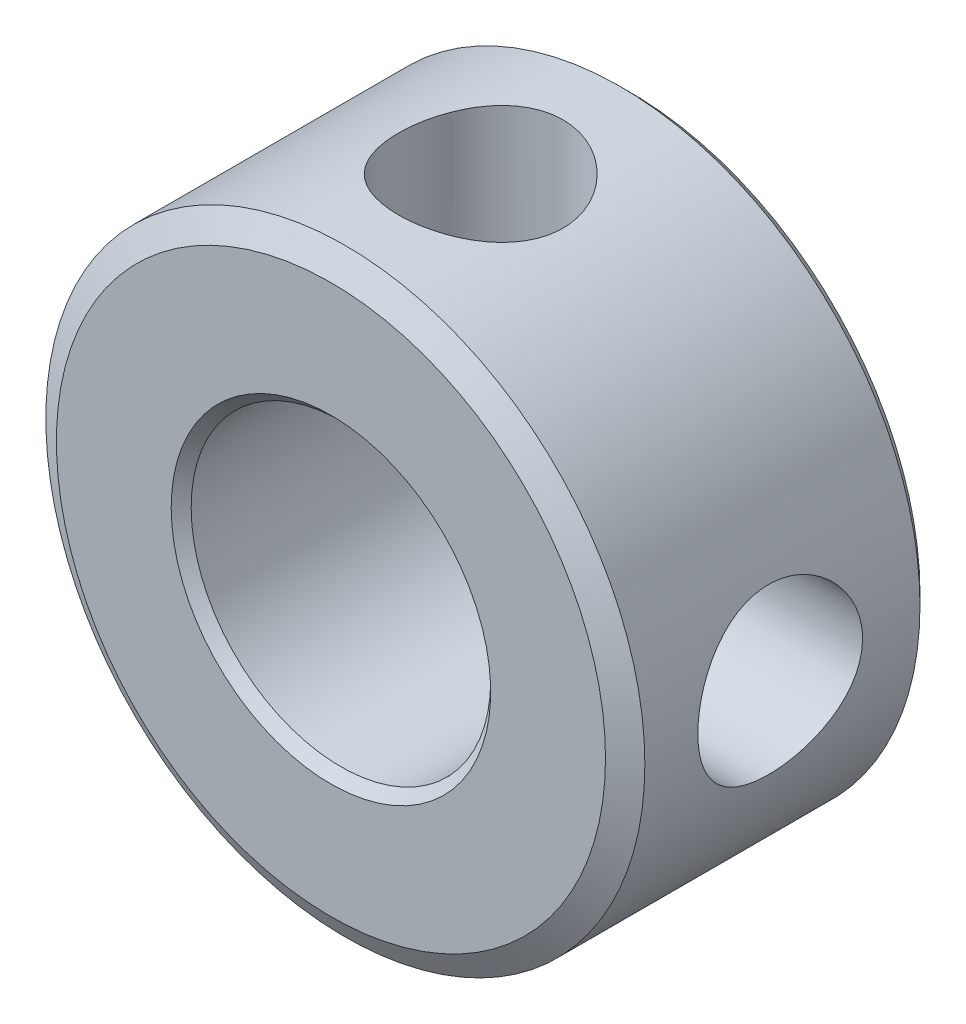
ISO-10303-21;
HEADER;
FILE_DESCRIPTION(('STEP AP214'),'2;1');
FILE_NAME('part.step','',(''),(''),'','','');
FILE_SCHEMA(('AUTOMOTIVE_DESIGN { 1 0 10303 214 1 1 1 1 }'));
ENDSEC;
DATA;
#1=APPLICATION_CONTEXT('core data for automotive mechanical design processes');
#2=APPLICATION_PROTOCOL_DEFINITION('international standard','automotive_design',2000,#1);
#3=PRODUCT_CONTEXT('',#1,'mechanical');
#4=PRODUCT('Part','Part','',(#3));
#5=PRODUCT_RELATED_PRODUCT_CATEGORY('part','',(#4));
#6=PRODUCT_DEFINITION_FORMATION('','',#4);
#7=PRODUCT_DEFINITION_CONTEXT('part definition',#1,'design');
#8=PRODUCT_DEFINITION('design','',#6,#7);
#9=PRODUCT_DEFINITION_SHAPE('','',#8);
#10=(LENGTH_UNIT() NAMED_UNIT(*) SI_UNIT(.MILLI.,.METRE.));
#11=(NAMED_UNIT(*) PLANE_ANGLE_UNIT() SI_UNIT($,.RADIAN.));
#12=(NAMED_UNIT(*) SI_UNIT($,.STERADIAN.) SOLID_ANGLE_UNIT());
#13=UNCERTAINTY_MEASURE_WITH_UNIT(LENGTH_MEASURE(1.E-05),#10,'distance_accuracy_value','');
#14=(GEOMETRIC_REPRESENTATION_CONTEXT(3) GLOBAL_UNCERTAINTY_ASSIGNED_CONTEXT((#13)) GLOBAL_UNIT_ASSIGNED_CONTEXT((#10,
#11,#12)) REPRESENTATION_CONTEXT('',''));
#15=CARTESIAN_POINT('',(0.,0.,0.));
#16=DIRECTION('',(0.,0.,1.));
#17=DIRECTION('',(1.,0.,0.));
#18=AXIS2_PLACEMENT_3D('',#15,#16,#17);
#19=CARTESIAN_POINT('',(0.,0.,0.));
#20=DIRECTION('',(0.,0.,1.));
#21=DIRECTION('',(1.,0.,0.));
#22=AXIS2_PLACEMENT_3D('',#19,#20,#21);
#23=CYLINDRICAL_SURFACE('',#22,6.);
#24=CARTESIAN_POINT('',(0.,6.,-1.35));
#25=CARTESIAN_POINT('',(-0.0908537283276959,5.99999874308259,-1.35000192900356));
#26=CARTESIAN_POINT('',(-0.181727733575568,5.99791622790463,-1.35752910087248));
#27=CARTESIAN_POINT('',(-0.360851012556402,5.98981117624032,-1.38738129819334));
#28=CARTESIAN_POINT('',(-0.449099121993646,5.98378691845858,-1.40971278850842));
#29=CARTESIAN_POINT('',(-0.62035967550026,5.96846215356675,-1.46838748646491));
#30=CARTESIAN_POINT('',(-0.703378936424505,5.95916602079348,-1.50471199222699));
#31=CARTESIAN_POINT('',(-0.862147532275072,5.9382760100701,-1.59027047316168));
#32=CARTESIAN_POINT('',(-0.937896261330001,5.92668194087358,-1.63950552292817));
#33=CARTESIAN_POINT('',(-1.08183136781088,5.90212624569014,-1.7507618800266));
#34=CARTESIAN_POINT('',(-1.14981405351216,5.88914009329631,-1.81304129579587));
#35=CARTESIAN_POINT('',(-1.27451362220699,5.86341857808967,-1.94806716570051));
#36=CARTESIAN_POINT('',(-1.33122895521962,5.85068324999801,-2.02081505754999));
#37=CARTESIAN_POINT('',(-1.43279568288042,5.82665244921014,-2.17636199718006));
#38=CARTESIAN_POINT('',(-1.47740934109683,5.81538781414375,-2.25932148269526));
#39=CARTESIAN_POINT('',(-1.55197373568299,5.79593589094513,-2.43192408048678));
#40=CARTESIAN_POINT('',(-1.58192736761612,5.78774799518745,-2.5215658688796));
#41=CARTESIAN_POINT('',(-1.62560750003859,5.7756304093822,-2.70272466375945));
#42=CARTESIAN_POINT('',(-1.63970484886951,5.77160359132479,-2.79414559423327));
#43=CARTESIAN_POINT('',(-1.65242890666582,5.76797418839314,-2.97813673611729));
#44=CARTESIAN_POINT('',(-1.65105870633264,5.76837071965198,-3.07070671423395));
#45=CARTESIAN_POINT('',(-1.63318021863208,5.77345648215431,-3.25144544871845));
#46=CARTESIAN_POINT('',(-1.61712435820282,5.77801741181752,-3.33966314867066));
#47=CARTESIAN_POINT('',(-1.57105645702899,5.79071212543296,-3.5121015428571));
#48=CARTESIAN_POINT('',(-1.54104323793963,5.79884621104432,-3.59632189895534));
#49=CARTESIAN_POINT('',(-1.46755257403608,5.8178810068791,-3.75953664649985));
#50=CARTESIAN_POINT('',(-1.42391940277051,5.82881343808644,-3.83845706293225));
#51=CARTESIAN_POINT('',(-1.32453594216561,5.8521965018176,-3.98801308967004));
#52=CARTESIAN_POINT('',(-1.26878313205863,5.86464744994142,-4.05864697174372));
#53=CARTESIAN_POINT('',(-1.14444557863618,5.89019543667637,-4.19220548799731));
#54=CARTESIAN_POINT('',(-1.07548193780207,5.90329988395932,-4.25477649008794));
#55=CARTESIAN_POINT('',(-0.927879174135835,5.92829105959038,-4.36754009171226));
#56=CARTESIAN_POINT('',(-0.849239620758374,5.94017773370855,-4.41773214012565));
#57=CARTESIAN_POINT('',(-0.683947027422496,5.96147504122309,-4.50448258165223));
#58=CARTESIAN_POINT('',(-0.597256901414118,5.97087336103955,-4.54097353369754));
#59=CARTESIAN_POINT('',(-0.418654132043704,5.98604617450553,-4.59875969929591));
#60=CARTESIAN_POINT('',(-0.326742710235056,5.9918215119967,-4.62005845147649));
#61=CARTESIAN_POINT('',(-0.143321506269138,5.99896860669685,-4.64629239149309));
#62=CARTESIAN_POINT('',(-0.0518853661978218,6.00046960488126,-4.65170798633319));
#63=CARTESIAN_POINT('',(0.13058988459751,5.99927229231555,-4.64735333458747));
#64=CARTESIAN_POINT('',(0.221629038059,5.9965744453723,-4.63758476525333));
#65=CARTESIAN_POINT('',(0.398987770207998,5.98736635921293,-4.60353193851751));
#66=CARTESIAN_POINT('',(0.485363423879031,5.98092734475059,-4.57951869821484));
#67=CARTESIAN_POINT('',(0.652849667611912,5.96497031766694,-4.51797560507925));
#68=CARTESIAN_POINT('',(0.733959668311753,5.95545196109898,-4.48044424228852));
#69=CARTESIAN_POINT('',(0.890455295917683,5.93409297712807,-4.39205978335043));
#70=CARTESIAN_POINT('',(0.965689503643771,5.92220874688328,-4.34094938630763));
#71=CARTESIAN_POINT('',(1.1066809671127,5.89749009177705,-4.2271784596786));
#72=CARTESIAN_POINT('',(1.17243622308682,5.88465546727347,-4.16451549919106));
#73=CARTESIAN_POINT('',(1.29465015721015,5.85900191245661,-4.02717154749665));
#74=CARTESIAN_POINT('',(1.35076903800646,5.84619510636324,-3.95218534092955));
#75=CARTESIAN_POINT('',(1.44963820489912,5.82246888214058,-3.79358648666387));
#76=CARTESIAN_POINT('',(1.49238901579837,5.81154938992678,-3.70997417777973));
#77=CARTESIAN_POINT('',(1.56298916810732,5.79296111659894,-3.53688766981547));
#78=CARTESIAN_POINT('',(1.59092227269253,5.78527411484172,-3.44744970116939));
#79=CARTESIAN_POINT('',(1.63127619202049,5.77402677636451,-3.26489646253751));
#80=CARTESIAN_POINT('',(1.64370128166883,5.77046530242997,-3.17178221325177));
#81=CARTESIAN_POINT('',(1.65242931750206,5.76797147491958,-2.98801011718676));
#82=CARTESIAN_POINT('',(1.64928014369358,5.76888180213839,-2.89738004914483));
#83=CARTESIAN_POINT('',(1.62822879843177,5.77485828369776,-2.7179965839993));
#84=CARTESIAN_POINT('',(1.61032705344815,5.77992431790445,-2.62924313272223));
#85=CARTESIAN_POINT('',(1.56060549557288,5.7935447800639,-2.45687102265176));
#86=CARTESIAN_POINT('',(1.52890872620598,5.80206832439478,-2.37321425734279));
#87=CARTESIAN_POINT('',(1.45259209961126,5.82164247853969,-2.21234139001191));
#88=CARTESIAN_POINT('',(1.40797010013714,5.83269350719869,-2.13512635838694));
#89=CARTESIAN_POINT('',(1.30543867870844,5.856507274906,-1.98673082694536));
#90=CARTESIAN_POINT('',(1.24715873005677,5.8693126029988,-1.91581314496999));
#91=CARTESIAN_POINT('',(1.11966133853961,5.89496224754912,-1.78458628887661));
#92=CARTESIAN_POINT('',(1.05044120164629,5.9078065728436,-1.72427973550572));
#93=CARTESIAN_POINT('',(0.901092250249274,5.93244341761611,-1.61460740742057));
#94=CARTESIAN_POINT('',(0.820747709123238,5.94420464277088,-1.56552774389036));
#95=CARTESIAN_POINT('',(0.652625872638596,5.96500063379118,-1.48164813328711));
#96=CARTESIAN_POINT('',(0.564853084925043,5.97403703816731,-1.44683960003828));
#97=CARTESIAN_POINT('',(0.397919658743002,5.98728597467613,-1.39669636748502));
#98=CARTESIAN_POINT('',(0.319434916548891,5.99201791048024,-1.3792274520486));
#99=CARTESIAN_POINT('',(0.160638594873061,5.99837530343306,-1.35587906975128));
#100=CARTESIAN_POINT('',(0.0803272226686441,6.00000111128829,-1.34999829449489));
#101=CARTESIAN_POINT('',(0.,6.,-1.35));
#102=B_SPLINE_CURVE_WITH_KNOTS('',3,(#24,#25,#26,#27,#28,#29,#30,#31,#32,#33,#34,#35,#36,#37,
#38,#39,#40,#41,#42,#43,#44,#45,#46,#47,#48,#49,#50,#51,#52,#53,#54,#55,#56,#57,#58,#59,#60,#61,
#62,#63,#64,#65,#66,#67,#68,#69,#70,#71,#72,#73,#74,#75,#76,#77,#78,#79,#80,#81,#82,#83,#84,#85,
#86,#87,#88,#89,#90,#91,#92,#93,#94,#95,#96,#97,#98,#99,#100,#101),.UNSPECIFIED.,.T.,.F.,(4,2,2,
2,2,2,2,2,2,2,2,2,2,2,2,2,2,2,2,2,2,2,2,2,2,2,2,2,2,2,2,2,2,2,2,2,2,2,4),(0.,0.272266491235062,
0.544651956274203,0.816674629991574,1.08871995238569,1.36676668474294,1.64485163984642,
1.92805811024662,2.21120862075008,2.48758935156345,2.76391485738987,3.03200413559448,
3.30011605124617,3.57141329094732,3.84276701193228,4.12355975427328,4.4043649954619,
4.68653487032464,4.96863899957848,5.24211776230094,5.51556631854552,5.78397200237262,
6.05240767608969,6.32634577802896,6.60034158820946,6.88259284524953,7.16483302029486,
7.44546024030154,7.72601008612322,7.99676228549105,8.26750665818486,8.53588411360169,
8.80430607576226,9.08108736952955,9.3579369273538,9.64120588287104,9.9243041596233,
10.1650524617278,10.4057735798283),.UNSPECIFIED.);
#103=CARTESIAN_POINT('',(0.,6.,-1.35));
#104=VERTEX_POINT('',#103);
#105=EDGE_CURVE('E79',#104,#104,#102,.T.);
#106=ORIENTED_EDGE('',*,*,#105,.T.);
#107=EDGE_LOOP('',(#106));
#108=FACE_BOUND('',#107,.T.);
#109=CARTESIAN_POINT('',(6.,0.,-1.35));
#110=CARTESIAN_POINT('',(5.99999874308259,0.090853728327675,-1.35000192900356));
#111=CARTESIAN_POINT('',(5.99791622790463,0.181727733575547,-1.35752910087248));
#112=CARTESIAN_POINT('',(5.98981117624032,0.360851012556381,-1.38738129819334));
#113=CARTESIAN_POINT('',(5.98378691845858,0.449099121993626,-1.40971278850842));
#114=CARTESIAN_POINT('',(5.96846215356675,0.620359675500239,-1.46838748646491));
#115=CARTESIAN_POINT('',(5.95916602079348,0.703378936424484,-1.50471199222699));
#116=CARTESIAN_POINT('',(5.9382760100701,0.862147532275051,-1.59027047316168));
#117=CARTESIAN_POINT('',(5.92668194087359,0.937896261329981,-1.63950552292817));
#118=CARTESIAN_POINT('',(5.90212624569014,1.08183136781086,-1.7507618800266));
#119=CARTESIAN_POINT('',(5.88914009329631,1.14981405351214,-1.81304129579587));
#120=CARTESIAN_POINT('',(5.86341857808968,1.27451362220697,-1.94806716570051));
#121=CARTESIAN_POINT('',(5.85068324999801,1.3312289552196,-2.02081505754999));
#122=CARTESIAN_POINT('',(5.82665244921015,1.4327956828804,-2.17636199718006));
#123=CARTESIAN_POINT('',(5.81538781414375,1.47740934109681,-2.25932148269526));
#124=CARTESIAN_POINT('',(5.79593589094514,1.55197373568297,-2.43192408048678));
#125=CARTESIAN_POINT('',(5.78774799518746,1.5819273676161,-2.5215658688796));
#126=CARTESIAN_POINT('',(5.77563040938221,1.62560750003857,-2.70272466375945));
#127=CARTESIAN_POINT('',(5.7716035913248,1.63970484886949,-2.79414559423327));
#128=CARTESIAN_POINT('',(5.76797418839314,1.6524289066658,-2.97813673611729));
#129=CARTESIAN_POINT('',(5.76837071965198,1.65105870633262,-3.07070671423395));
#130=CARTESIAN_POINT('',(5.77345648215432,1.63318021863206,-3.25144544871845));
#131=CARTESIAN_POINT('',(5.77801741181753,1.6171243582028,-3.33966314867066));
#132=CARTESIAN_POINT('',(5.79071212543296,1.57105645702897,-3.5121015428571));
#133=CARTESIAN_POINT('',(5.79884621104433,1.54104323793961,-3.59632189895534));
#134=CARTESIAN_POINT('',(5.81788100687911,1.46755257403606,-3.75953664649985));
#135=CARTESIAN_POINT('',(5.82881343808644,1.42391940277048,-3.83845706293225));
#136=CARTESIAN_POINT('',(5.8521965018176,1.32453594216559,-3.98801308967004));
#137=CARTESIAN_POINT('',(5.86464744994143,1.26878313205861,-4.05864697174372));
#138=CARTESIAN_POINT('',(5.89019543667637,1.14444557863616,-4.19220548799731));
#139=CARTESIAN_POINT('',(5.90329988395933,1.07548193780205,-4.25477649008794));
#140=CARTESIAN_POINT('',(5.92829105959039,0.927879174135814,-4.36754009171226));
#141=CARTESIAN_POINT('',(5.94017773370855,0.849239620758353,-4.41773214012565));
#142=CARTESIAN_POINT('',(5.9614750412231,0.683947027422475,-4.50448258165223));
#143=CARTESIAN_POINT('',(5.97087336103955,0.597256901414097,-4.54097353369754));
#144=CARTESIAN_POINT('',(5.98604617450554,0.418654132043683,-4.59875969929591));
#145=CARTESIAN_POINT('',(5.9918215119967,0.326742710235035,-4.62005845147649));
#146=CARTESIAN_POINT('',(5.99896860669685,0.143321506269118,-4.64629239149309));
#147=CARTESIAN_POINT('',(6.00046960488126,0.0518853661978014,-4.65170798633319));
#148=CARTESIAN_POINT('',(5.99927229231555,-0.13058988459753,-4.64735333458747));
#149=CARTESIAN_POINT('',(5.9965744453723,-0.221629038059021,-4.63758476525333));
#150=CARTESIAN_POINT('',(5.98736635921293,-0.398987770208018,-4.60353193851751));
#151=CARTESIAN_POINT('',(5.98092734475059,-0.485363423879051,-4.57951869821484));
#152=CARTESIAN_POINT('',(5.96497031766694,-0.652849667611932,-4.51797560507925));
#153=CARTESIAN_POINT('',(5.95545196109898,-0.733959668311773,-4.48044424228852));
#154=CARTESIAN_POINT('',(5.93409297712807,-0.890455295917704,-4.39205978335043));
#155=CARTESIAN_POINT('',(5.92220874688328,-0.965689503643791,-4.34094938630763));
#156=CARTESIAN_POINT('',(5.89749009177704,-1.10668096711272,-4.2271784596786));
#157=CARTESIAN_POINT('',(5.88465546727347,-1.17243622308684,-4.16451549919106));
#158=CARTESIAN_POINT('',(5.85900191245661,-1.29465015721017,-4.02717154749665));
#159=CARTESIAN_POINT('',(5.84619510636323,-1.35076903800648,-3.95218534092955));
#160=CARTESIAN_POINT('',(5.82246888214058,-1.44963820489914,-3.79358648666387));
#161=CARTESIAN_POINT('',(5.81154938992677,-1.49238901579839,-3.70997417777973));
#162=CARTESIAN_POINT('',(5.79296111659893,-1.56298916810734,-3.53688766981547));
#163=CARTESIAN_POINT('',(5.78527411484172,-1.59092227269255,-3.44744970116939));
#164=CARTESIAN_POINT('',(5.7740267763645,-1.63127619202051,-3.26489646253751));
#165=CARTESIAN_POINT('',(5.77046530242997,-1.64370128166885,-3.17178221325177));
#166=CARTESIAN_POINT('',(5.76797147491958,-1.65242931750208,-2.98801011718676));
#167=CARTESIAN_POINT('',(5.76888180213838,-1.64928014369361,-2.89738004914483));
#168=CARTESIAN_POINT('',(5.77485828369775,-1.62822879843179,-2.7179965839993));
#169=CARTESIAN_POINT('',(5.77992431790444,-1.61032705344817,-2.62924313272223));
#170=CARTESIAN_POINT('',(5.79354478006389,-1.5606054955729,-2.45687102265176));
#171=CARTESIAN_POINT('',(5.80206832439477,-1.528908726206,-2.37321425734279));
#172=CARTESIAN_POINT('',(5.82164247853969,-1.45259209961128,-2.21234139001191));
#173=CARTESIAN_POINT('',(5.83269350719868,-1.40797010013716,-2.13512635838694));
#174=CARTESIAN_POINT('',(5.85650727490599,-1.30543867870846,-1.98673082694536));
#175=CARTESIAN_POINT('',(5.8693126029988,-1.24715873005679,-1.91581314496999));
#176=CARTESIAN_POINT('',(5.89496224754911,-1.11966133853963,-1.78458628887661));
#177=CARTESIAN_POINT('',(5.90780657284359,-1.05044120164631,-1.72427973550572));
#178=CARTESIAN_POINT('',(5.93244341761611,-0.901092250249294,-1.61460740742057));
#179=CARTESIAN_POINT('',(5.94420464277088,-0.820747709123259,-1.56552774389036));
#180=CARTESIAN_POINT('',(5.96500063379117,-0.652625872638617,-1.48164813328711));
#181=CARTESIAN_POINT('',(5.97403703816731,-0.564853084925064,-1.44683960003828));
#182=CARTESIAN_POINT('',(5.98728597467612,-0.397919658743023,-1.39669636748502));
#183=CARTESIAN_POINT('',(5.99201791048024,-0.319434916548912,-1.3792274520486));
#184=CARTESIAN_POINT('',(5.99837530343306,-0.160638594873082,-1.35587906975128));
#185=CARTESIAN_POINT('',(6.00000111128829,-0.0803272226686651,-1.34999829449489));
#186=CARTESIAN_POINT('',(6.,0.,-1.35));
#187=B_SPLINE_CURVE_WITH_KNOTS('',3,(#109,#110,#111,#112,#113,#114,#115,#116,#117,#118,#119,
#120,#121,#122,#123,#124,#125,#126,#127,#128,#129,#130,#131,#132,#133,#134,#135,#136,#137,#138,
#139,#140,#141,#142,#143,#144,#145,#146,#147,#148,#149,#150,#151,#152,#153,#154,#155,#156,#157,
#158,#159,#160,#161,#162,#163,#164,#165,#166,#167,#168,#169,#170,#171,#172,#173,#174,#175,#176,
#177,#178,#179,#180,#181,#182,#183,#184,#185,#186),.UNSPECIFIED.,.T.,.F.,(4,2,2,2,2,2,2,2,2,2,2,
2,2,2,2,2,2,2,2,2,2,2,2,2,2,2,2,2,2,2,2,2,2,2,2,2,2,2,4),(0.,0.272266491235062,
0.544651956274203,0.816674629991574,1.08871995238569,1.36676668474294,1.64485163984642,
1.92805811024662,2.21120862075008,2.48758935156345,2.76391485738987,3.03200413559448,
3.30011605124617,3.57141329094732,3.84276701193229,4.12355975427328,4.4043649954619,
4.68653487032464,4.96863899957848,5.24211776230094,5.51556631854552,5.78397200237262,
6.05240767608969,6.32634577802896,6.60034158820946,6.88259284524953,7.16483302029486,
7.44546024030154,7.72601008612322,7.99676228549105,8.26750665818486,8.53588411360169,
8.80430607576225,9.08108736952955,9.3579369273538,9.64120588287104,9.9243041596233,
10.1650524617278,10.4057735798283),.UNSPECIFIED.);
#188=CARTESIAN_POINT('',(6.,0.,-1.35));
#189=VERTEX_POINT('',#188);
#190=EDGE_CURVE('E141',#189,#189,#187,.T.);
#191=ORIENTED_EDGE('',*,*,#190,.T.);
#192=EDGE_LOOP('',(#191));
#193=FACE_BOUND('',#192,.T.);
#194=CARTESIAN_POINT('',(0.,0.,-5.8));
#195=DIRECTION('',(0.,0.,1.));
#196=DIRECTION('',(1.,0.,0.));
#197=AXIS2_PLACEMENT_3D('',#194,#195,#196);
#198=CIRCLE('',#197,6.);
#199=CARTESIAN_POINT('',(6.,0.,-5.8));
#200=VERTEX_POINT('',#199);
#201=EDGE_CURVE('E11',#200,#200,#198,.T.);
#202=ORIENTED_EDGE('',*,*,#201,.T.);
#203=EDGE_LOOP('',(#202));
#204=FACE_BOUND('',#203,.T.);
#205=CARTESIAN_POINT('',(0.,0.,-0.288675134594819));
#206=DIRECTION('',(0.,0.,1.));
#207=DIRECTION('',(1.,0.,0.));
#208=AXIS2_PLACEMENT_3D('',#205,#206,#207);
#209=CIRCLE('',#208,6.);
#210=CARTESIAN_POINT('',(6.,0.,-0.288675134594819));
#211=VERTEX_POINT('',#210);
#212=EDGE_CURVE('E127',#211,#211,#209,.T.);
#213=ORIENTED_EDGE('',*,*,#212,.F.);
#214=EDGE_LOOP('',(#213));
#215=FACE_BOUND('',#214,.T.);
#216=ADVANCED_FACE('F45',(#108,#193,#204,#215),#23,.T.);
#217=CARTESIAN_POINT('',(0.,3.,0.));
#218=DIRECTION('',(0.,0.,-1.));
#219=DIRECTION('',(-1.,0.,0.));
#220=AXIS2_PLACEMENT_3D('',#217,#218,#219);
#221=PLANE('',#220);
#222=CARTESIAN_POINT('',(0.,0.,0.));
#223=DIRECTION('',(0.,0.,-1.));
#224=DIRECTION('',(-1.,0.,0.));
#225=AXIS2_PLACEMENT_3D('',#222,#223,#224);
#226=CIRCLE('',#225,3.20000000000001);
#227=CARTESIAN_POINT('',(-3.20000000000001,0.,0.));
#228=VERTEX_POINT('',#227);
#229=EDGE_CURVE('E65',#228,#228,#226,.T.);
#230=ORIENTED_EDGE('',*,*,#229,.T.);
#231=EDGE_LOOP('',(#230));
#232=FACE_BOUND('',#231,.T.);
#233=CARTESIAN_POINT('',(0.,0.,0.));
#234=DIRECTION('',(0.,0.,1.));
#235=DIRECTION('',(1.,0.,0.));
#236=AXIS2_PLACEMENT_3D('',#233,#234,#235);
#237=CIRCLE('',#236,5.5);
#238=CARTESIAN_POINT('',(5.5,0.,0.));
#239=VERTEX_POINT('',#238);
#240=EDGE_CURVE('E124',#239,#239,#237,.T.);
#241=ORIENTED_EDGE('',*,*,#240,.T.);
#242=EDGE_LOOP('',(#241));
#243=FACE_BOUND('',#242,.T.);
#244=ADVANCED_FACE('F112',(#232,#243),#221,.F.);
#245=CARTESIAN_POINT('',(0.,6.,-6.));
#246=DIRECTION('',(0.,0.,1.));
#247=DIRECTION('',(1.,0.,0.));
#248=AXIS2_PLACEMENT_3D('',#245,#246,#247);
#249=PLANE('',#248);
#250=CARTESIAN_POINT('',(0.,0.,-6.));
#251=DIRECTION('',(0.,0.,1.));
#252=DIRECTION('',(1.,0.,0.));
#253=AXIS2_PLACEMENT_3D('',#250,#251,#252);
#254=CIRCLE('',#253,3.2);
#255=CARTESIAN_POINT('',(3.2,0.,-6.));
#256=VERTEX_POINT('',#255);
#257=EDGE_CURVE('E53',#256,#256,#254,.T.);
#258=ORIENTED_EDGE('',*,*,#257,.T.);
#259=EDGE_LOOP('',(#258));
#260=FACE_BOUND('',#259,.T.);
#261=CARTESIAN_POINT('',(0.,0.,-6.));
#262=DIRECTION('',(0.,0.,1.));
#263=DIRECTION('',(1.,0.,0.));
#264=AXIS2_PLACEMENT_3D('',#261,#262,#263);
#265=CIRCLE('',#264,5.8);
#266=CARTESIAN_POINT('',(5.8,0.,-6.));
#267=VERTEX_POINT('',#266);
#268=EDGE_CURVE('E59',#267,#267,#265,.F.);
#269=ORIENTED_EDGE('',*,*,#268,.T.);
#270=EDGE_LOOP('',(#269));
#271=FACE_BOUND('',#270,.T.);
#272=ADVANCED_FACE('F110',(#260,#271),#249,.F.);
#273=CARTESIAN_POINT('',(0.,0.,0.));
#274=DIRECTION('',(0.,0.,1.));
#275=DIRECTION('',(1.,0.,0.));
#276=AXIS2_PLACEMENT_3D('',#273,#274,#275);
#277=CYLINDRICAL_SURFACE('',#276,3.);
#278=CARTESIAN_POINT('',(0.,0.,-0.200000000000003));
#279=DIRECTION('',(0.,0.,-1.));
#280=DIRECTION('',(-1.,0.,0.));
#281=AXIS2_PLACEMENT_3D('',#278,#279,#280);
#282=CIRCLE('',#281,3.);
#283=CARTESIAN_POINT('',(-3.,0.,-0.200000000000003));
#284=VERTEX_POINT('',#283);
#285=EDGE_CURVE('E71',#284,#284,#282,.F.);
#286=ORIENTED_EDGE('',*,*,#285,.T.);
#287=EDGE_LOOP('',(#286));
#288=FACE_BOUND('',#287,.T.);
#289=CARTESIAN_POINT('',(0.,0.,-5.8));
#290=DIRECTION('',(0.,0.,1.));
#291=DIRECTION('',(1.,0.,0.));
#292=AXIS2_PLACEMENT_3D('',#289,#290,#291);
#293=CIRCLE('',#292,3.);
#294=CARTESIAN_POINT('',(3.,0.,-5.8));
#295=VERTEX_POINT('',#294);
#296=EDGE_CURVE('E75',#295,#295,#293,.F.);
#297=ORIENTED_EDGE('',*,*,#296,.T.);
#298=EDGE_LOOP('',(#297));
#299=FACE_BOUND('',#298,.T.);
#300=CARTESIAN_POINT('',(3.,0.,-1.35));
#301=CARTESIAN_POINT('',(2.99999513886583,-0.08566994754531,-1.35000538337831));
#302=CARTESIAN_POINT('',(2.99629302255545,-0.171409071205657,-1.35671064559098));
#303=CARTESIAN_POINT('',(2.9818478399119,-0.340286051726058,-1.38320221523037));
#304=CARTESIAN_POINT('',(2.97109516282084,-0.423420195379871,-1.40300637834803));
#305=CARTESIAN_POINT('',(2.9436571869529,-0.584401577928648,-1.45465446432168));
#306=CARTESIAN_POINT('',(2.92699634956489,-0.662269062667429,-1.48644877862966));
#307=CARTESIAN_POINT('',(2.8892116252981,-0.811408240635773,-1.56087866817395));
#308=CARTESIAN_POINT('',(2.86808754775152,-0.882679651896683,-1.60351470658008));
#309=CARTESIAN_POINT('',(2.82153252993505,-1.02211619357276,-1.70171533312459));
#310=CARTESIAN_POINT('',(2.79590528013301,-1.08973037342792,-1.75796752444415));
#311=CARTESIAN_POINT('',(2.74375354722835,-1.21508634233518,-1.8802916084601));
#312=CARTESIAN_POINT('',(2.71722825277821,-1.27281890234561,-1.94637257436953));
#313=CARTESIAN_POINT('',(2.6632189582999,-1.38251917690997,-2.09422598592267));
#314=CARTESIAN_POINT('',(2.635897965792,-1.43335857713387,-2.17690296148472));
#315=CARTESIAN_POINT('',(2.58678336476683,-1.5202154773594,-2.35122736563263));
#316=CARTESIAN_POINT('',(2.56498539395022,-1.55624468911681,-2.44286763485725));
#317=CARTESIAN_POINT('',(2.53163475086557,-1.60989890926139,-2.6267694484273));
#318=CARTESIAN_POINT('',(2.51952192354842,-1.6285426334708,-2.71862615345284));
#319=CARTESIAN_POINT('',(2.5055890563389,-1.64991120631135,-2.90488944855667));
#320=CARTESIAN_POINT('',(2.50375425894471,-1.65265887915298,-2.99929218702398));
#321=CARTESIAN_POINT('',(2.51015646726157,-1.64290000078865,-3.17242835674957));
#322=CARTESIAN_POINT('',(2.51690299364891,-1.63265157443425,-3.25135975849933));
#323=CARTESIAN_POINT('',(2.53703527550372,-1.60118639026895,-3.40612941990325));
#324=CARTESIAN_POINT('',(2.55042405491466,-1.57996463656911,-3.4819662536941));
#325=CARTESIAN_POINT('',(2.58256130946141,-1.52687641342516,-3.6304823200009));
#326=CARTESIAN_POINT('',(2.60141910516921,-1.49479033069662,-3.7030582377923));
#327=CARTESIAN_POINT('',(2.64240902469131,-1.42107429999089,-3.84217102059684));
#328=CARTESIAN_POINT('',(2.66454256035721,-1.37944023253662,-3.90870526158194));
#329=CARTESIAN_POINT('',(2.71379040847905,-1.28018349411556,-4.04489478358012));
#330=CARTESIAN_POINT('',(2.74113957142577,-1.22107458392544,-4.11338605188438));
#331=CARTESIAN_POINT('',(2.79497377887705,-1.09224532196502,-4.24002658065135));
#332=CARTESIAN_POINT('',(2.82145822218592,-1.02251777065965,-4.29816876589242));
#333=CARTESIAN_POINT('',(2.87272134052731,-0.868605041800946,-4.40621482668338));
#334=CARTESIAN_POINT('',(2.89726648156192,-0.783763861453053,-4.45530464062892));
#335=CARTESIAN_POINT('',(2.93971528365153,-0.605352377645243,-4.53808075343747));
#336=CARTESIAN_POINT('',(2.95762518579738,-0.511790381196004,-4.57178153416669));
#337=CARTESIAN_POINT('',(2.98333345624201,-0.327907037980988,-4.61961221043824));
#338=CARTESIAN_POINT('',(2.99191822782612,-0.238095480523299,-4.63527255151752));
#339=CARTESIAN_POINT('',(3.00083376662002,-0.056732533442524,-4.65153082870694));
#340=CARTESIAN_POINT('',(3.00116980828416,0.0348177069344239,-4.65213838996179));
#341=CARTESIAN_POINT('',(2.99394177831786,0.207487375150847,-4.63896548669445));
#342=CARTESIAN_POINT('',(2.98714659587173,0.288751776237429,-4.62658539871821));
#343=CARTESIAN_POINT('',(2.96746793830126,0.447838849624837,-4.59015740266736));
#344=CARTESIAN_POINT('',(2.95458384737082,0.5256611729379,-4.56610831443354));
#345=CARTESIAN_POINT('',(2.92349378037744,0.677753407865893,-4.50664238404831));
#346=CARTESIAN_POINT('',(2.90517475144826,0.751904240945366,-4.47098230445308));
#347=CARTESIAN_POINT('',(2.86484215103297,0.893363199749693,-4.38962865370027));
#348=CARTESIAN_POINT('',(2.8428272299655,0.960668811424097,-4.34393141551639));
#349=CARTESIAN_POINT('',(2.7942033159395,1.09455456288908,-4.23795528586164));
#350=CARTESIAN_POINT('',(2.76735592347542,1.16021004375817,-4.176616716341));
#351=CARTESIAN_POINT('',(2.71365440736756,1.28079913012787,-4.04407557032251));
#352=CARTESIAN_POINT('',(2.6868003055646,1.33572155748715,-3.97286284071763));
#353=CARTESIAN_POINT('',(2.63385875511374,1.4374725406666,-3.81583580659287));
#354=CARTESIAN_POINT('',(2.60799295737884,1.48334076829297,-3.72931692312463));
#355=CARTESIAN_POINT('',(2.56323063992908,1.55942876653782,-3.54800592029134));
#356=CARTESIAN_POINT('',(2.54432398053561,1.58967133039467,-3.45322608860008));
#357=CARTESIAN_POINT('',(2.51825420457376,1.63062462554039,-3.26773762241447));
#358=CARTESIAN_POINT('',(2.51013022153209,1.64294477567077,-3.1775252194605));
#359=CARTESIAN_POINT('',(2.50386093509844,1.65249034912288,-2.99598953071196));
#360=CARTESIAN_POINT('',(2.50570706604925,1.6497287296726,-2.90466726572743));
#361=CARTESIAN_POINT('',(2.51807870697286,1.63075691736924,-2.73678047844449));
#362=CARTESIAN_POINT('',(2.52738874118224,1.61642825416934,-2.65989902646688));
#363=CARTESIAN_POINT('',(2.55192145753237,1.57741079979875,-2.50980458104002));
#364=CARTESIAN_POINT('',(2.56714656833463,1.55271775279778,-2.43659310839999));
#365=CARTESIAN_POINT('',(2.60289749299614,1.49205611796199,-2.29086035370703));
#366=CARTESIAN_POINT('',(2.62369085726805,1.45548954002738,-2.2186560041008));
#367=CARTESIAN_POINT('',(2.66794671801683,1.37268509596928,-2.08092397849966));
#368=CARTESIAN_POINT('',(2.69141062791392,1.32644209751912,-2.01539987321332));
#369=CARTESIAN_POINT('',(2.74276036037727,1.21715006880684,-1.88215026044466));
#370=CARTESIAN_POINT('',(2.77076245736401,1.15260264369495,-1.81569176481672));
#371=CARTESIAN_POINT('',(2.82486614857147,1.01279351012942,-1.69411557257786));
#372=CARTESIAN_POINT('',(2.85096636964492,0.937524174112375,-1.639006018451));
#373=CARTESIAN_POINT('',(2.89948189270181,0.774887264813815,-1.54006196603415));
#374=CARTESIAN_POINT('',(2.92173740350452,0.687189892415579,-1.49668643559364));
#375=CARTESIAN_POINT('',(2.95878417900051,0.504223640414884,-1.42589028566926));
#376=CARTESIAN_POINT('',(2.97359457153256,0.40897489894884,-1.39842875222927));
#377=CARTESIAN_POINT('',(2.98911434756595,0.260510618519062,-1.36985794198771));
#378=CARTESIAN_POINT('',(2.99318008334623,0.208783056433911,-1.36242756798774));
#379=CARTESIAN_POINT('',(2.99862437594613,0.104712273399582,-1.35249698717911));
#380=CARTESIAN_POINT('',(3.00000297155585,0.0523690613485637,-1.34999670920227));
#381=CARTESIAN_POINT('',(3.,0.,-1.35));
#382=B_SPLINE_CURVE_WITH_KNOTS('',3,(#300,#301,#302,#303,#304,#305,#306,#307,#308,#309,#310,
#311,#312,#313,#314,#315,#316,#317,#318,#319,#320,#321,#322,#323,#324,#325,#326,#327,#328,#329,
#330,#331,#332,#333,#334,#335,#336,#337,#338,#339,#340,#341,#342,#343,#344,#345,#346,#347,#348,
#349,#350,#351,#352,#353,#354,#355,#356,#357,#358,#359,#360,#361,#362,#363,#364,#365,#366,#367,
#368,#369,#370,#371,#372,#373,#374,#375,#376,#377,#378,#379,#380,#381),.UNSPECIFIED.,.T.,.F.,(4,
2,2,2,2,2,2,2,2,2,2,2,2,2,2,2,2,2,2,2,2,2,2,2,2,2,2,2,2,2,2,2,2,2,2,2,2,2,2,2,4),(0.,
0.256799016537927,0.513948810602823,0.770046131883809,1.02615439574975,1.29988051794781,
1.57386091081864,1.87483382859252,2.17556827984511,2.45730761481344,2.7386423161532,
2.97715628850378,3.21577894619804,3.45954576386221,3.70341795322454,3.98576982265921,
4.26831398861797,4.5698079028087,4.87101750814851,5.14417314031287,5.41715410504554,
5.66345591892143,5.90978264803878,6.16164305576709,6.41359563296034,6.69375293580822,
6.97420047673715,7.27643629132653,7.57822997932257,7.85076329691248,8.12306250931443,
8.35830132419629,8.59363682764366,8.84338665158086,9.09326927891542,9.38234984684169,
9.67163710326651,9.97098879991469,10.2695674268337,10.4265480013941,10.5835263098519),.UNSPECIFIED.);
#383=CARTESIAN_POINT('',(3.,0.,-1.35));
#384=VERTEX_POINT('',#383);
#385=EDGE_CURVE('E132',#384,#384,#382,.T.);
#386=ORIENTED_EDGE('',*,*,#385,.T.);
#387=EDGE_LOOP('',(#386));
#388=FACE_BOUND('',#387,.T.);
#389=CARTESIAN_POINT('',(0.,3.,-1.35));
#390=CARTESIAN_POINT('',(0.0856699475452995,2.99999513886583,-1.35000538337831));
#391=CARTESIAN_POINT('',(0.171409071205646,2.99629302255545,-1.35671064559098));
#392=CARTESIAN_POINT('',(0.340286051726047,2.9818478399119,-1.38320221523036));
#393=CARTESIAN_POINT('',(0.42342019537986,2.97109516282085,-1.40300637834803));
#394=CARTESIAN_POINT('',(0.584401577928637,2.9436571869529,-1.45465446432168));
#395=CARTESIAN_POINT('',(0.662269062667419,2.92699634956489,-1.48644877862966));
#396=CARTESIAN_POINT('',(0.811408240635763,2.8892116252981,-1.56087866817395));
#397=CARTESIAN_POINT('',(0.882679651896673,2.86808754775153,-1.60351470658008));
#398=CARTESIAN_POINT('',(1.02211619357275,2.82153252993505,-1.70171533312459));
#399=CARTESIAN_POINT('',(1.08973037342791,2.79590528013301,-1.75796752444415));
#400=CARTESIAN_POINT('',(1.21508634233517,2.74375354722835,-1.8802916084601));
#401=CARTESIAN_POINT('',(1.2728189023456,2.71722825277821,-1.94637257436953));
#402=CARTESIAN_POINT('',(1.38251917690996,2.66321895829991,-2.09422598592267));
#403=CARTESIAN_POINT('',(1.43335857713386,2.635897965792,-2.17690296148472));
#404=CARTESIAN_POINT('',(1.52021547735939,2.58678336476683,-2.35122736563263));
#405=CARTESIAN_POINT('',(1.5562446891168,2.56498539395023,-2.44286763485725));
#406=CARTESIAN_POINT('',(1.60989890926138,2.53163475086558,-2.6267694484273));
#407=CARTESIAN_POINT('',(1.62854263347079,2.51952192354843,-2.71862615345284));
#408=CARTESIAN_POINT('',(1.64991120631134,2.5055890563389,-2.90488944855667));
#409=CARTESIAN_POINT('',(1.65265887915297,2.50375425894471,-2.99929218702398));
#410=CARTESIAN_POINT('',(1.64290000078864,2.51015646726158,-3.17242835674957));
#411=CARTESIAN_POINT('',(1.63265157443424,2.51690299364892,-3.25135975849933));
#412=CARTESIAN_POINT('',(1.60118639026894,2.53703527550373,-3.40612941990325));
#413=CARTESIAN_POINT('',(1.5799646365691,2.55042405491467,-3.4819662536941));
#414=CARTESIAN_POINT('',(1.52687641342515,2.58256130946142,-3.6304823200009));
#415=CARTESIAN_POINT('',(1.49479033069661,2.60141910516922,-3.7030582377923));
#416=CARTESIAN_POINT('',(1.42107429999088,2.64240902469132,-3.84217102059683));
#417=CARTESIAN_POINT('',(1.37944023253661,2.66454256035721,-3.90870526158194));
#418=CARTESIAN_POINT('',(1.28018349411555,2.71379040847906,-4.04489478358012));
#419=CARTESIAN_POINT('',(1.22107458392543,2.74113957142577,-4.11338605188438));
#420=CARTESIAN_POINT('',(1.09224532196501,2.79497377887706,-4.24002658065135));
#421=CARTESIAN_POINT('',(1.02251777065964,2.82145822218593,-4.29816876589242));
#422=CARTESIAN_POINT('',(0.868605041800936,2.87272134052732,-4.40621482668338));
#423=CARTESIAN_POINT('',(0.783763861453043,2.89726648156192,-4.45530464062892));
#424=CARTESIAN_POINT('',(0.605352377645232,2.93971528365153,-4.53808075343747));
#425=CARTESIAN_POINT('',(0.511790381195994,2.95762518579738,-4.57178153416669));
#426=CARTESIAN_POINT('',(0.327907037980978,2.98333345624201,-4.61961221043824));
#427=CARTESIAN_POINT('',(0.238095480523289,2.99191822782612,-4.63527255151752));
#428=CARTESIAN_POINT('',(0.0567325334425135,3.00083376662002,-4.65153082870694));
#429=CARTESIAN_POINT('',(-0.0348177069344344,3.00116980828416,-4.65213838996179));
#430=CARTESIAN_POINT('',(-0.207487375150857,2.99394177831786,-4.63896548669445));
#431=CARTESIAN_POINT('',(-0.288751776237439,2.98714659587173,-4.62658539871821));
#432=CARTESIAN_POINT('',(-0.447838849624848,2.96746793830126,-4.59015740266736));
#433=CARTESIAN_POINT('',(-0.525661172937911,2.95458384737082,-4.56610831443354));
#434=CARTESIAN_POINT('',(-0.677753407865903,2.92349378037744,-4.50664238404831));
#435=CARTESIAN_POINT('',(-0.751904240945377,2.90517475144826,-4.47098230445308));
#436=CARTESIAN_POINT('',(-0.893363199749703,2.86484215103297,-4.38962865370027));
#437=CARTESIAN_POINT('',(-0.960668811424107,2.8428272299655,-4.34393141551639));
#438=CARTESIAN_POINT('',(-1.09455456288909,2.79420331593949,-4.23795528586164));
#439=CARTESIAN_POINT('',(-1.16021004375818,2.76735592347542,-4.176616716341));
#440=CARTESIAN_POINT('',(-1.28079913012788,2.71365440736755,-4.04407557032251));
#441=CARTESIAN_POINT('',(-1.33572155748716,2.6868003055646,-3.97286284071763));
#442=CARTESIAN_POINT('',(-1.43747254066661,2.63385875511374,-3.81583580659287));
#443=CARTESIAN_POINT('',(-1.48334076829298,2.60799295737883,-3.72931692312463));
#444=CARTESIAN_POINT('',(-1.55942876653783,2.56323063992907,-3.54800592029134));
#445=CARTESIAN_POINT('',(-1.58967133039468,2.54432398053561,-3.45322608860008));
#446=CARTESIAN_POINT('',(-1.6306246255404,2.51825420457375,-3.26773762241448));
#447=CARTESIAN_POINT('',(-1.64294477567078,2.51013022153209,-3.17752521946051));
#448=CARTESIAN_POINT('',(-1.65249034912289,2.50386093509844,-2.99598953071196));
#449=CARTESIAN_POINT('',(-1.64972872967261,2.50570706604924,-2.90466726572743));
#450=CARTESIAN_POINT('',(-1.63075691736925,2.51807870697285,-2.73678047844449));
#451=CARTESIAN_POINT('',(-1.61642825416934,2.52738874118223,-2.65989902646688));
#452=CARTESIAN_POINT('',(-1.57741079979876,2.55192145753237,-2.50980458104002));
#453=CARTESIAN_POINT('',(-1.55271775279779,2.56714656833463,-2.43659310839999));
#454=CARTESIAN_POINT('',(-1.492056117962,2.60289749299613,-2.29086035370703));
#455=CARTESIAN_POINT('',(-1.45548954002739,2.62369085726804,-2.2186560041008));
#456=CARTESIAN_POINT('',(-1.37268509596929,2.66794671801683,-2.08092397849966));
#457=CARTESIAN_POINT('',(-1.32644209751913,2.69141062791391,-2.01539987321332));
#458=CARTESIAN_POINT('',(-1.21715006880685,2.74276036037727,-1.88215026044467));
#459=CARTESIAN_POINT('',(-1.15260264369496,2.77076245736401,-1.81569176481672));
#460=CARTESIAN_POINT('',(-1.01279351012944,2.82486614857147,-1.69411557257786));
#461=CARTESIAN_POINT('',(-0.937524174112385,2.85096636964491,-1.639006018451));
#462=CARTESIAN_POINT('',(-0.774887264813826,2.89948189270181,-1.54006196603415));
#463=CARTESIAN_POINT('',(-0.687189892415589,2.92173740350452,-1.49668643559364));
#464=CARTESIAN_POINT('',(-0.504223640414894,2.95878417900051,-1.42589028566926));
#465=CARTESIAN_POINT('',(-0.408974898948851,2.97359457153256,-1.39842875222927));
#466=CARTESIAN_POINT('',(-0.260510618519073,2.98911434756595,-1.36985794198771));
#467=CARTESIAN_POINT('',(-0.208783056433922,2.99318008334623,-1.36242756798774));
#468=CARTESIAN_POINT('',(-0.104712273399592,2.99862437594613,-1.35249698717911));
#469=CARTESIAN_POINT('',(-0.0523690613485742,3.00000297155585,-1.34999670920227));
#470=CARTESIAN_POINT('',(0.,3.,-1.35));
#471=B_SPLINE_CURVE_WITH_KNOTS('',3,(#389,#390,#391,#392,#393,#394,#395,#396,#397,#398,#399,
#400,#401,#402,#403,#404,#405,#406,#407,#408,#409,#410,#411,#412,#413,#414,#415,#416,#417,#418,
#419,#420,#421,#422,#423,#424,#425,#426,#427,#428,#429,#430,#431,#432,#433,#434,#435,#436,#437,
#438,#439,#440,#441,#442,#443,#444,#445,#446,#447,#448,#449,#450,#451,#452,#453,#454,#455,#456,
#457,#458,#459,#460,#461,#462,#463,#464,#465,#466,#467,#468,#469,#470),.UNSPECIFIED.,.T.,.F.,(4,
2,2,2,2,2,2,2,2,2,2,2,2,2,2,2,2,2,2,2,2,2,2,2,2,2,2,2,2,2,2,2,2,2,2,2,2,2,2,2,4),(0.,
0.256799016537927,0.513948810602823,0.770046131883809,1.02615439574975,1.29988051794781,
1.57386091081864,1.87483382859252,2.17556827984511,2.45730761481344,2.7386423161532,
2.97715628850378,3.21577894619804,3.45954576386221,3.70341795322454,3.98576982265921,
4.26831398861796,4.5698079028087,4.87101750814851,5.14417314031287,5.41715410504554,
5.66345591892143,5.90978264803878,6.16164305576709,6.41359563296034,6.69375293580821,
6.97420047673715,7.27643629132653,7.57822997932257,7.85076329691247,8.12306250931443,
8.35830132419629,8.59363682764366,8.84338665158086,9.09326927891542,9.38234984684168,
9.67163710326651,9.97098879991468,10.2695674268337,10.4265480013941,10.5835263098519),.UNSPECIFIED.);
#472=CARTESIAN_POINT('',(0.,3.,-1.35));
#473=VERTEX_POINT('',#472);
#474=EDGE_CURVE('E88',#473,#473,#471,.T.);
#475=ORIENTED_EDGE('',*,*,#474,.T.);
#476=EDGE_LOOP('',(#475));
#477=FACE_BOUND('',#476,.T.);
#478=ADVANCED_FACE('F102',(#288,#299,#388,#477),#277,.F.);
#479=CARTESIAN_POINT('',(0.,6.,-3.));
#480=DIRECTION('',(0.,1.,0.));
#481=DIRECTION('',(0.,0.,1.));
#482=AXIS2_PLACEMENT_3D('',#479,#480,#481);
#483=CYLINDRICAL_SURFACE('',#482,1.65);
#484=ORIENTED_EDGE('',*,*,#474,.F.);
#485=EDGE_LOOP('',(#484));
#486=FACE_BOUND('',#485,.T.);
#487=ORIENTED_EDGE('',*,*,#105,.F.);
#488=EDGE_LOOP('',(#487));
#489=FACE_BOUND('',#488,.T.);
#490=ADVANCED_FACE('F97',(#486,#489),#483,.F.);
#491=CARTESIAN_POINT('',(6.,0.,-3.));
#492=DIRECTION('',(1.,0.,0.));
#493=DIRECTION('',(0.,0.,1.));
#494=AXIS2_PLACEMENT_3D('',#491,#492,#493);
#495=CYLINDRICAL_SURFACE('',#494,1.65);
#496=ORIENTED_EDGE('',*,*,#385,.F.);
#497=EDGE_LOOP('',(#496));
#498=FACE_BOUND('',#497,.T.);
#499=ORIENTED_EDGE('',*,*,#190,.F.);
#500=EDGE_LOOP('',(#499));
#501=FACE_BOUND('',#500,.T.);
#502=ADVANCED_FACE('F101',(#498,#501),#495,.F.);
#503=CARTESIAN_POINT('',(0.,0.,-0.200000000000003));
#504=DIRECTION('',(0.,0.,1.));
#505=DIRECTION('',(1.,0.,0.));
#506=AXIS2_PLACEMENT_3D('',#503,#504,#505);
#507=CONICAL_SURFACE('',#506,3.,0.785398163397454);
#508=ORIENTED_EDGE('',*,*,#229,.F.);
#509=EDGE_LOOP('',(#508));
#510=FACE_BOUND('',#509,.T.);
#511=ORIENTED_EDGE('',*,*,#285,.F.);
#512=EDGE_LOOP('',(#511));
#513=FACE_BOUND('',#512,.T.);
#514=ADVANCED_FACE('F149',(#510,#513),#507,.F.);
#515=CARTESIAN_POINT('',(0.,0.,-6.));
#516=DIRECTION('',(0.,0.,-1.));
#517=DIRECTION('',(-1.,0.,0.));
#518=AXIS2_PLACEMENT_3D('',#515,#516,#517);
#519=CONICAL_SURFACE('',#518,3.2,0.785398163397444);
#520=ORIENTED_EDGE('',*,*,#296,.F.);
#521=EDGE_LOOP('',(#520));
#522=FACE_BOUND('',#521,.T.);
#523=ORIENTED_EDGE('',*,*,#257,.F.);
#524=EDGE_LOOP('',(#523));
#525=FACE_BOUND('',#524,.T.);
#526=ADVANCED_FACE('F158',(#522,#525),#519,.F.);
#527=CARTESIAN_POINT('',(0.,0.,-5.8));
#528=DIRECTION('',(0.,0.,1.));
#529=DIRECTION('',(1.,0.,0.));
#530=AXIS2_PLACEMENT_3D('',#527,#528,#529);
#531=CONICAL_SURFACE('',#530,6.,0.785398163397448);
#532=ORIENTED_EDGE('',*,*,#268,.F.);
#533=EDGE_LOOP('',(#532));
#534=FACE_BOUND('',#533,.T.);
#535=ORIENTED_EDGE('',*,*,#201,.F.);
#536=EDGE_LOOP('',(#535));
#537=FACE_BOUND('',#536,.T.);
#538=ADVANCED_FACE('F47',(#534,#537),#531,.T.);
#539=CARTESIAN_POINT('',(0.,0.,0.));
#540=DIRECTION('',(0.,0.,-1.));
#541=DIRECTION('',(-1.,0.,0.));
#542=AXIS2_PLACEMENT_3D('',#539,#540,#541);
#543=CONICAL_SURFACE('',#542,5.5,1.04719755119659);
#544=ORIENTED_EDGE('',*,*,#212,.T.);
#545=EDGE_LOOP('',(#544));
#546=FACE_BOUND('',#545,.T.);
#547=ORIENTED_EDGE('',*,*,#240,.F.);
#548=EDGE_LOOP('',(#547));
#549=FACE_BOUND('',#548,.T.);
#550=ADVANCED_FACE('F151',(#546,#549),#543,.T.);
#551=CLOSED_SHELL('',(#216,#244,#272,#478,#490,#502,#514,#526,#538,#550));
#552=MANIFOLD_SOLID_BREP('B2',#551);
#553=ADVANCED_BREP_SHAPE_REPRESENTATION('',(#18,#552),#14);
#554=SHAPE_DEFINITION_REPRESENTATION(#9,#553);
ENDSEC;
END-ISO-10303-21;
